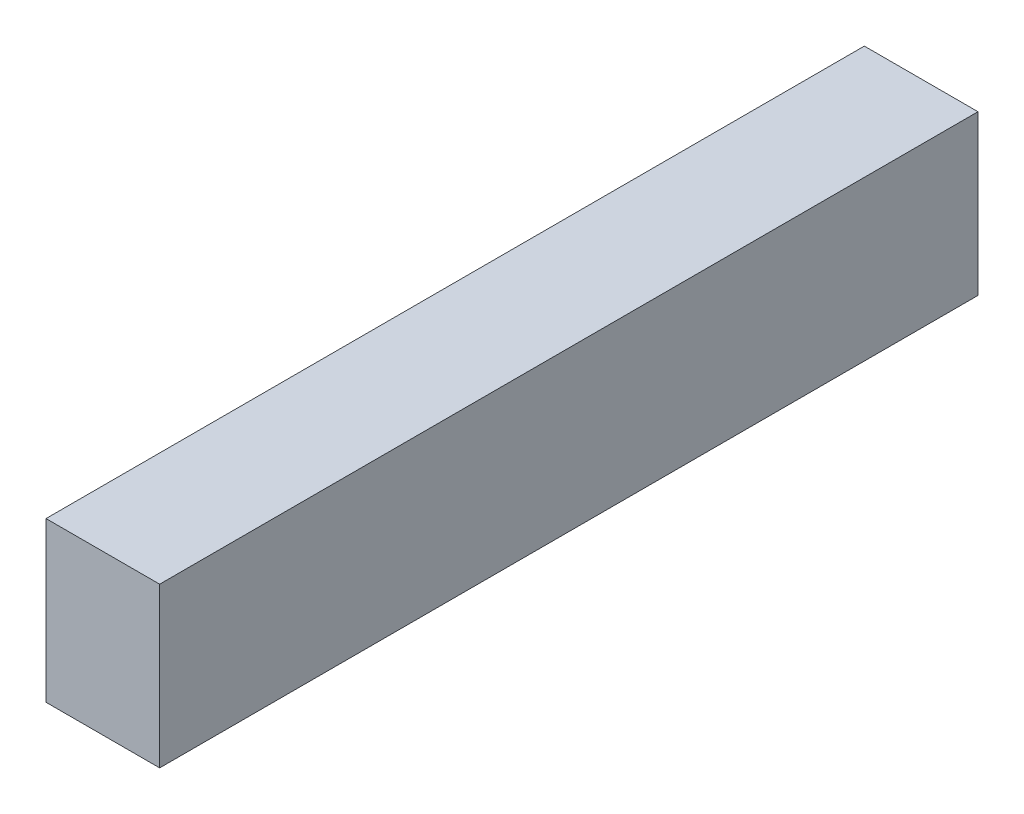
ISO-10303-21;
HEADER;
FILE_DESCRIPTION(('STEP AP214'),'2;1');
FILE_NAME('part.step','',(''),(''),'','','');
FILE_SCHEMA(('AUTOMOTIVE_DESIGN { 1 0 10303 214 1 1 1 1 }'));
ENDSEC;
DATA;
#1=APPLICATION_CONTEXT('core data for automotive mechanical design processes');
#2=APPLICATION_PROTOCOL_DEFINITION('international standard','automotive_design',2000,#1);
#3=PRODUCT_CONTEXT('',#1,'mechanical');
#4=PRODUCT('Part','Part','',(#3));
#5=PRODUCT_RELATED_PRODUCT_CATEGORY('part','',(#4));
#6=PRODUCT_DEFINITION_FORMATION('','',#4);
#7=PRODUCT_DEFINITION_CONTEXT('part definition',#1,'design');
#8=PRODUCT_DEFINITION('design','',#6,#7);
#9=PRODUCT_DEFINITION_SHAPE('','',#8);
#10=(LENGTH_UNIT() NAMED_UNIT(*) SI_UNIT(.MILLI.,.METRE.));
#11=(NAMED_UNIT(*) PLANE_ANGLE_UNIT() SI_UNIT($,.RADIAN.));
#12=(NAMED_UNIT(*) SI_UNIT($,.STERADIAN.) SOLID_ANGLE_UNIT());
#13=UNCERTAINTY_MEASURE_WITH_UNIT(LENGTH_MEASURE(1.E-05),#10,'distance_accuracy_value','');
#14=(GEOMETRIC_REPRESENTATION_CONTEXT(3) GLOBAL_UNCERTAINTY_ASSIGNED_CONTEXT((#13)) GLOBAL_UNIT_ASSIGNED_CONTEXT((#10,
#11,#12)) REPRESENTATION_CONTEXT('',''));
#15=CARTESIAN_POINT('',(0.,0.,0.));
#16=DIRECTION('',(0.,0.,1.));
#17=DIRECTION('',(1.,0.,0.));
#18=AXIS2_PLACEMENT_3D('',#15,#16,#17);
#19=CARTESIAN_POINT('',(25.,-17.5,-90.));
#20=DIRECTION('',(0.,0.,1.));
#21=DIRECTION('',(1.,0.,0.));
#22=AXIS2_PLACEMENT_3D('',#19,#20,#21);
#23=PLANE('',#22);
#24=DIRECTION('',(0.,1.,0.));
#25=VECTOR('',#24,1.);
#26=CARTESIAN_POINT('',(0.,-17.5,-90.));
#27=LINE('',#26,#25);
#28=CARTESIAN_POINT('',(0.,-17.5,-90.));
#29=VERTEX_POINT('',#28);
#30=CARTESIAN_POINT('',(0.,17.5,-90.));
#31=VERTEX_POINT('',#30);
#32=EDGE_CURVE('E120',#29,#31,#27,.T.);
#33=ORIENTED_EDGE('',*,*,#32,.T.);
#34=DIRECTION('',(-1.,0.,0.));
#35=VECTOR('',#34,1.);
#36=CARTESIAN_POINT('',(25.,17.5,-90.));
#37=LINE('',#36,#35);
#38=CARTESIAN_POINT('',(25.,17.5,-90.));
#39=VERTEX_POINT('',#38);
#40=EDGE_CURVE('E11',#39,#31,#37,.T.);
#41=ORIENTED_EDGE('',*,*,#40,.F.);
#42=DIRECTION('',(0.,1.,0.));
#43=VECTOR('',#42,1.);
#44=CARTESIAN_POINT('',(25.,-17.5,-90.));
#45=LINE('',#44,#43);
#46=CARTESIAN_POINT('',(25.,-17.5,-90.));
#47=VERTEX_POINT('',#46);
#48=EDGE_CURVE('E102',#47,#39,#45,.T.);
#49=ORIENTED_EDGE('',*,*,#48,.F.);
#50=DIRECTION('',(-1.,0.,0.));
#51=VECTOR('',#50,1.);
#52=CARTESIAN_POINT('',(25.,-17.5,-90.));
#53=LINE('',#52,#51);
#54=EDGE_CURVE('E116',#47,#29,#53,.T.);
#55=ORIENTED_EDGE('',*,*,#54,.T.);
#56=EDGE_LOOP('',(#33,#41,#49,#55));
#57=FACE_BOUND('',#56,.T.);
#58=ADVANCED_FACE('F50',(#57),#23,.F.);
#59=CARTESIAN_POINT('',(25.,17.5,89.9999999999999));
#60=DIRECTION('',(0.,-1.,0.));
#61=DIRECTION('',(0.,0.,-1.));
#62=AXIS2_PLACEMENT_3D('',#59,#60,#61);
#63=PLANE('',#62);
#64=DIRECTION('',(0.,0.,1.));
#65=VECTOR('',#64,1.);
#66=CARTESIAN_POINT('',(0.,17.5,89.9999999999999));
#67=LINE('',#66,#65);
#68=CARTESIAN_POINT('',(0.,17.5,89.9999999999999));
#69=VERTEX_POINT('',#68);
#70=EDGE_CURVE('E107',#31,#69,#67,.T.);
#71=ORIENTED_EDGE('',*,*,#70,.T.);
#72=DIRECTION('',(-1.,0.,0.));
#73=VECTOR('',#72,1.);
#74=CARTESIAN_POINT('',(25.,17.5,89.9999999999999));
#75=LINE('',#74,#73);
#76=CARTESIAN_POINT('',(25.,17.5,89.9999999999999));
#77=VERTEX_POINT('',#76);
#78=EDGE_CURVE('E59',#77,#69,#75,.T.);
#79=ORIENTED_EDGE('',*,*,#78,.F.);
#80=DIRECTION('',(0.,0.,1.));
#81=VECTOR('',#80,1.);
#82=CARTESIAN_POINT('',(25.,17.5,89.9999999999999));
#83=LINE('',#82,#81);
#84=EDGE_CURVE('E97',#39,#77,#83,.T.);
#85=ORIENTED_EDGE('',*,*,#84,.F.);
#86=ORIENTED_EDGE('',*,*,#40,.T.);
#87=EDGE_LOOP('',(#71,#79,#85,#86));
#88=FACE_BOUND('',#87,.T.);
#89=ADVANCED_FACE('F106',(#88),#63,.F.);
#90=CARTESIAN_POINT('',(25.,-17.5,89.9999999999999));
#91=DIRECTION('',(0.,0.,-1.));
#92=DIRECTION('',(-1.,0.,0.));
#93=AXIS2_PLACEMENT_3D('',#90,#91,#92);
#94=PLANE('',#93);
#95=DIRECTION('',(0.,-1.,0.));
#96=VECTOR('',#95,1.);
#97=CARTESIAN_POINT('',(0.,-17.5,89.9999999999999));
#98=LINE('',#97,#96);
#99=CARTESIAN_POINT('',(0.,-17.5,89.9999999999999));
#100=VERTEX_POINT('',#99);
#101=EDGE_CURVE('E84',#69,#100,#98,.T.);
#102=ORIENTED_EDGE('',*,*,#101,.T.);
#103=DIRECTION('',(-1.,0.,0.));
#104=VECTOR('',#103,1.);
#105=CARTESIAN_POINT('',(25.,-17.5,89.9999999999999));
#106=LINE('',#105,#104);
#107=CARTESIAN_POINT('',(25.,-17.5,89.9999999999999));
#108=VERTEX_POINT('',#107);
#109=EDGE_CURVE('E109',#108,#100,#106,.T.);
#110=ORIENTED_EDGE('',*,*,#109,.F.);
#111=DIRECTION('',(0.,-1.,0.));
#112=VECTOR('',#111,1.);
#113=CARTESIAN_POINT('',(25.,-17.5,89.9999999999999));
#114=LINE('',#113,#112);
#115=EDGE_CURVE('E100',#77,#108,#114,.T.);
#116=ORIENTED_EDGE('',*,*,#115,.F.);
#117=ORIENTED_EDGE('',*,*,#78,.T.);
#118=EDGE_LOOP('',(#102,#110,#116,#117));
#119=FACE_BOUND('',#118,.T.);
#120=ADVANCED_FACE('F110',(#119),#94,.F.);
#121=CARTESIAN_POINT('',(25.,-17.5,89.9999999999999));
#122=DIRECTION('',(0.,1.,0.));
#123=DIRECTION('',(0.,0.,1.));
#124=AXIS2_PLACEMENT_3D('',#121,#122,#123);
#125=PLANE('',#124);
#126=DIRECTION('',(0.,0.,-1.));
#127=VECTOR('',#126,1.);
#128=CARTESIAN_POINT('',(0.,-17.5,89.9999999999999));
#129=LINE('',#128,#127);
#130=EDGE_CURVE('E90',#100,#29,#129,.T.);
#131=ORIENTED_EDGE('',*,*,#130,.T.);
#132=ORIENTED_EDGE('',*,*,#54,.F.);
#133=DIRECTION('',(0.,0.,-1.));
#134=VECTOR('',#133,1.);
#135=CARTESIAN_POINT('',(25.,-17.5,89.9999999999999));
#136=LINE('',#135,#134);
#137=EDGE_CURVE('E67',#108,#47,#136,.T.);
#138=ORIENTED_EDGE('',*,*,#137,.F.);
#139=ORIENTED_EDGE('',*,*,#109,.T.);
#140=EDGE_LOOP('',(#131,#132,#138,#139));
#141=FACE_BOUND('',#140,.T.);
#142=ADVANCED_FACE('F135',(#141),#125,.F.);
#143=CARTESIAN_POINT('',(25.,0.,0.));
#144=DIRECTION('',(-1.,0.,0.));
#145=DIRECTION('',(0.,0.,1.));
#146=AXIS2_PLACEMENT_3D('',#143,#144,#145);
#147=PLANE('',#146);
#148=ORIENTED_EDGE('',*,*,#48,.T.);
#149=ORIENTED_EDGE('',*,*,#84,.T.);
#150=ORIENTED_EDGE('',*,*,#115,.T.);
#151=ORIENTED_EDGE('',*,*,#137,.T.);
#152=EDGE_LOOP('',(#148,#149,#150,#151));
#153=FACE_BOUND('',#152,.T.);
#154=ADVANCED_FACE('F98',(#153),#147,.F.);
#155=CARTESIAN_POINT('',(0.,0.,0.));
#156=DIRECTION('',(-1.,0.,0.));
#157=DIRECTION('',(0.,0.,1.));
#158=AXIS2_PLACEMENT_3D('',#155,#156,#157);
#159=PLANE('',#158);
#160=ORIENTED_EDGE('',*,*,#32,.F.);
#161=ORIENTED_EDGE('',*,*,#130,.F.);
#162=ORIENTED_EDGE('',*,*,#101,.F.);
#163=ORIENTED_EDGE('',*,*,#70,.F.);
#164=EDGE_LOOP('',(#160,#161,#162,#163));
#165=FACE_BOUND('',#164,.T.);
#166=ADVANCED_FACE('F138',(#165),#159,.T.);
#167=CLOSED_SHELL('',(#58,#89,#120,#142,#154,#166));
#168=MANIFOLD_SOLID_BREP('B2',#167);
#169=ADVANCED_BREP_SHAPE_REPRESENTATION('',(#18,#168),#14);
#170=SHAPE_DEFINITION_REPRESENTATION(#9,#169);
ENDSEC;
END-ISO-10303-21;
